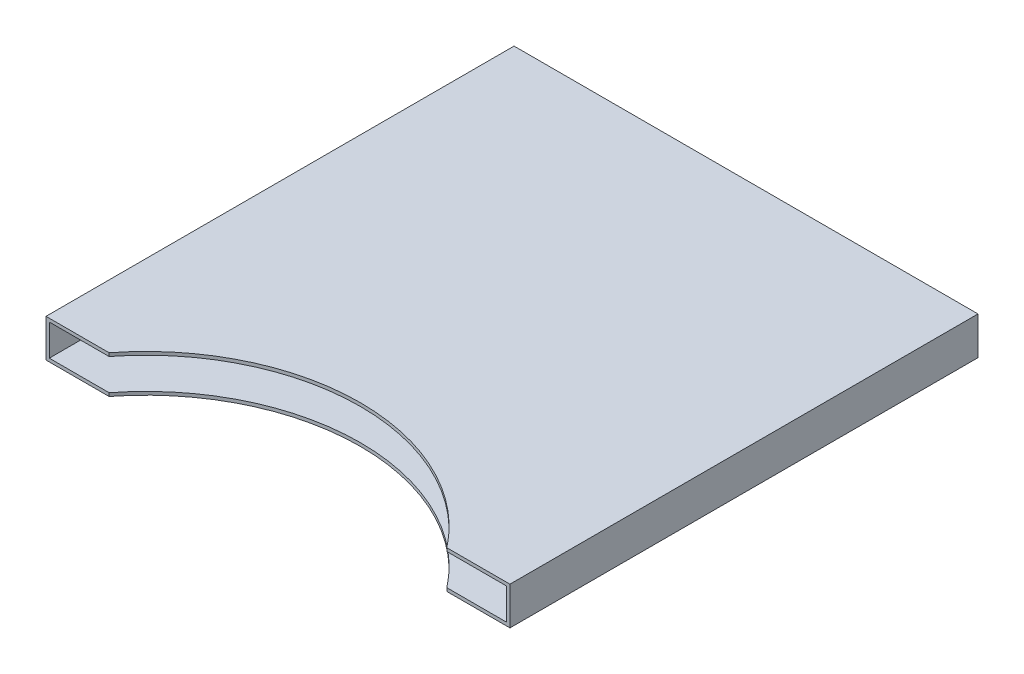
ISO-10303-21;
HEADER;
FILE_DESCRIPTION(('STEP AP214'),'2;1');
FILE_NAME('part.step','',(''),(''),'','','');
FILE_SCHEMA(('AUTOMOTIVE_DESIGN { 1 0 10303 214 1 1 1 1 }'));
ENDSEC;
DATA;
#1=APPLICATION_CONTEXT('core data for automotive mechanical design processes');
#2=APPLICATION_PROTOCOL_DEFINITION('international standard','automotive_design',2000,#1);
#3=PRODUCT_CONTEXT('',#1,'mechanical');
#4=PRODUCT('Part','Part','',(#3));
#5=PRODUCT_RELATED_PRODUCT_CATEGORY('part','',(#4));
#6=PRODUCT_DEFINITION_FORMATION('','',#4);
#7=PRODUCT_DEFINITION_CONTEXT('part definition',#1,'design');
#8=PRODUCT_DEFINITION('design','',#6,#7);
#9=PRODUCT_DEFINITION_SHAPE('','',#8);
#10=(LENGTH_UNIT() NAMED_UNIT(*) SI_UNIT(.MILLI.,.METRE.));
#11=(NAMED_UNIT(*) PLANE_ANGLE_UNIT() SI_UNIT($,.RADIAN.));
#12=(NAMED_UNIT(*) SI_UNIT($,.STERADIAN.) SOLID_ANGLE_UNIT());
#13=UNCERTAINTY_MEASURE_WITH_UNIT(LENGTH_MEASURE(1.E-05),#10,'distance_accuracy_value','');
#14=(GEOMETRIC_REPRESENTATION_CONTEXT(3) GLOBAL_UNCERTAINTY_ASSIGNED_CONTEXT((#13)) GLOBAL_UNIT_ASSIGNED_CONTEXT((#10,
#11,#12)) REPRESENTATION_CONTEXT('',''));
#15=CARTESIAN_POINT('',(0.,0.,0.));
#16=DIRECTION('',(0.,0.,1.));
#17=DIRECTION('',(1.,0.,0.));
#18=AXIS2_PLACEMENT_3D('',#15,#16,#17);
#19=CARTESIAN_POINT('',(0.,2.3,8.));
#20=DIRECTION('',(0.,1.,0.));
#21=DIRECTION('',(0.,0.,1.));
#22=AXIS2_PLACEMENT_3D('',#19,#20,#21);
#23=CYLINDRICAL_SURFACE('',#22,13.);
#24=CARTESIAN_POINT('',(0.,2.3,8.));
#25=DIRECTION('',(0.,1.,0.));
#26=DIRECTION('',(0.,0.,1.));
#27=AXIS2_PLACEMENT_3D('',#24,#25,#26);
#28=CIRCLE('',#27,13.);
#29=CARTESIAN_POINT('',(-10.2469507659597,2.3,0.));
#30=VERTEX_POINT('',#29);
#31=CARTESIAN_POINT('',(10.2469507659597,2.3,0.));
#32=VERTEX_POINT('',#31);
#33=EDGE_CURVE('E105',#30,#32,#28,.F.);
#34=ORIENTED_EDGE('',*,*,#33,.F.);
#35=DIRECTION('',(0.,1.,0.));
#36=VECTOR('',#35,1.);
#37=CARTESIAN_POINT('',(-10.2469507659598,2.3,1.96023752785379E-13));
#38=LINE('',#37,#36);
#39=CARTESIAN_POINT('',(-10.2469507659597,2.1,0.));
#40=VERTEX_POINT('',#39);
#41=EDGE_CURVE('E101',#40,#30,#38,.T.);
#42=ORIENTED_EDGE('',*,*,#41,.F.);
#43=CARTESIAN_POINT('',(0.,2.1,8.));
#44=DIRECTION('',(0.,1.,0.));
#45=DIRECTION('',(0.,0.,1.));
#46=AXIS2_PLACEMENT_3D('',#43,#44,#45);
#47=CIRCLE('',#46,13.);
#48=CARTESIAN_POINT('',(10.2469507659597,2.1,0.));
#49=VERTEX_POINT('',#48);
#50=EDGE_CURVE('E19',#40,#49,#47,.F.);
#51=ORIENTED_EDGE('',*,*,#50,.T.);
#52=DIRECTION('',(0.,1.,0.));
#53=VECTOR('',#52,1.);
#54=CARTESIAN_POINT('',(10.2469507659598,2.3,1.94289029309402E-13));
#55=LINE('',#54,#53);
#56=EDGE_CURVE('E108',#32,#49,#55,.F.);
#57=ORIENTED_EDGE('',*,*,#56,.F.);
#58=EDGE_LOOP('',(#34,#42,#51,#57));
#59=FACE_BOUND('',#58,.T.);
#60=ADVANCED_FACE('F16',(#59),#23,.F.);
#61=CARTESIAN_POINT('',(14.075,0.,-28.2));
#62=DIRECTION('',(0.,0.,-1.));
#63=DIRECTION('',(-1.,0.,0.));
#64=AXIS2_PLACEMENT_3D('',#61,#62,#63);
#65=PLANE('',#64);
#66=DIRECTION('',(1.,0.,0.));
#67=VECTOR('',#66,1.);
#68=CARTESIAN_POINT('',(0.,2.1,-28.2));
#69=LINE('',#68,#67);
#70=CARTESIAN_POINT('',(13.875,2.1,-28.2));
#71=VERTEX_POINT('',#70);
#72=CARTESIAN_POINT('',(-13.875,2.1,-28.2));
#73=VERTEX_POINT('',#72);
#74=EDGE_CURVE('E138',#71,#73,#69,.F.);
#75=ORIENTED_EDGE('',*,*,#74,.T.);
#76=DIRECTION('',(0.,1.,0.));
#77=VECTOR('',#76,1.);
#78=CARTESIAN_POINT('',(-13.875,0.,-28.2));
#79=LINE('',#78,#77);
#80=CARTESIAN_POINT('',(-13.875,0.2,-28.2));
#81=VERTEX_POINT('',#80);
#82=EDGE_CURVE('E119',#73,#81,#79,.F.);
#83=ORIENTED_EDGE('',*,*,#82,.T.);
#84=DIRECTION('',(1.,0.,0.));
#85=VECTOR('',#84,1.);
#86=CARTESIAN_POINT('',(0.,0.2,-28.2));
#87=LINE('',#86,#85);
#88=CARTESIAN_POINT('',(13.875,0.2,-28.2));
#89=VERTEX_POINT('',#88);
#90=EDGE_CURVE('E166',#89,#81,#87,.F.);
#91=ORIENTED_EDGE('',*,*,#90,.F.);
#92=DIRECTION('',(0.,1.,0.));
#93=VECTOR('',#92,1.);
#94=CARTESIAN_POINT('',(13.875,0.,-28.2));
#95=LINE('',#94,#93);
#96=EDGE_CURVE('E181',#89,#71,#95,.T.);
#97=ORIENTED_EDGE('',*,*,#96,.T.);
#98=EDGE_LOOP('',(#75,#83,#91,#97));
#99=FACE_BOUND('',#98,.T.);
#100=ADVANCED_FACE('F376',(#99),#65,.F.);
#101=CARTESIAN_POINT('',(13.875,0.,0.));
#102=DIRECTION('',(1.,0.,0.));
#103=DIRECTION('',(0.,0.,-1.));
#104=AXIS2_PLACEMENT_3D('',#101,#102,#103);
#105=PLANE('',#104);
#106=ORIENTED_EDGE('',*,*,#96,.F.);
#107=DIRECTION('',(0.,0.,1.));
#108=VECTOR('',#107,1.);
#109=CARTESIAN_POINT('',(13.875,0.2,0.));
#110=LINE('',#109,#108);
#111=CARTESIAN_POINT('',(13.875,0.2,0.));
#112=VERTEX_POINT('',#111);
#113=EDGE_CURVE('E163',#112,#89,#110,.F.);
#114=ORIENTED_EDGE('',*,*,#113,.F.);
#115=DIRECTION('',(0.,1.,0.));
#116=VECTOR('',#115,1.);
#117=CARTESIAN_POINT('',(13.875,0.,0.));
#118=LINE('',#117,#116);
#119=CARTESIAN_POINT('',(13.875,2.1,0.));
#120=VERTEX_POINT('',#119);
#121=EDGE_CURVE('E160',#120,#112,#118,.F.);
#122=ORIENTED_EDGE('',*,*,#121,.F.);
#123=DIRECTION('',(0.,0.,1.));
#124=VECTOR('',#123,1.);
#125=CARTESIAN_POINT('',(13.875,2.1,0.));
#126=LINE('',#125,#124);
#127=EDGE_CURVE('E118',#120,#71,#126,.F.);
#128=ORIENTED_EDGE('',*,*,#127,.T.);
#129=EDGE_LOOP('',(#106,#114,#122,#128));
#130=FACE_BOUND('',#129,.T.);
#131=ADVANCED_FACE('F367',(#130),#105,.F.);
#132=CARTESIAN_POINT('',(-13.875,0.,-28.4));
#133=DIRECTION('',(-1.,0.,0.));
#134=DIRECTION('',(0.,0.,1.));
#135=AXIS2_PLACEMENT_3D('',#132,#133,#134);
#136=PLANE('',#135);
#137=ORIENTED_EDGE('',*,*,#82,.F.);
#138=DIRECTION('',(0.,0.,1.));
#139=VECTOR('',#138,1.);
#140=CARTESIAN_POINT('',(-13.875,2.1,0.));
#141=LINE('',#140,#139);
#142=CARTESIAN_POINT('',(-13.875,2.1,0.));
#143=VERTEX_POINT('',#142);
#144=EDGE_CURVE('E136',#73,#143,#141,.T.);
#145=ORIENTED_EDGE('',*,*,#144,.T.);
#146=DIRECTION('',(0.,1.,0.));
#147=VECTOR('',#146,1.);
#148=CARTESIAN_POINT('',(-13.875,0.,0.));
#149=LINE('',#148,#147);
#150=CARTESIAN_POINT('',(-13.875,0.2,0.));
#151=VERTEX_POINT('',#150);
#152=EDGE_CURVE('E124',#151,#143,#149,.T.);
#153=ORIENTED_EDGE('',*,*,#152,.F.);
#154=DIRECTION('',(0.,0.,1.));
#155=VECTOR('',#154,1.);
#156=CARTESIAN_POINT('',(-13.875,0.2,0.));
#157=LINE('',#156,#155);
#158=EDGE_CURVE('E185',#81,#151,#157,.T.);
#159=ORIENTED_EDGE('',*,*,#158,.F.);
#160=EDGE_LOOP('',(#137,#145,#153,#159));
#161=FACE_BOUND('',#160,.T.);
#162=ADVANCED_FACE('F359',(#161),#136,.F.);
#163=CARTESIAN_POINT('',(0.,2.1,0.));
#164=DIRECTION('',(0.,1.,0.));
#165=DIRECTION('',(0.,0.,1.));
#166=AXIS2_PLACEMENT_3D('',#163,#164,#165);
#167=PLANE('',#166);
#168=ORIENTED_EDGE('',*,*,#74,.F.);
#169=ORIENTED_EDGE('',*,*,#127,.F.);
#170=DIRECTION('',(1.,0.,0.));
#171=VECTOR('',#170,1.);
#172=CARTESIAN_POINT('',(-14.075,2.1,0.));
#173=LINE('',#172,#171);
#174=EDGE_CURVE('E117',#49,#120,#173,.T.);
#175=ORIENTED_EDGE('',*,*,#174,.F.);
#176=ORIENTED_EDGE('',*,*,#50,.F.);
#177=DIRECTION('',(1.,0.,0.));
#178=VECTOR('',#177,1.);
#179=CARTESIAN_POINT('',(-14.075,2.1,0.));
#180=LINE('',#179,#178);
#181=EDGE_CURVE('E115',#143,#40,#180,.T.);
#182=ORIENTED_EDGE('',*,*,#181,.F.);
#183=ORIENTED_EDGE('',*,*,#144,.F.);
#184=EDGE_LOOP('',(#168,#169,#175,#176,#182,#183));
#185=FACE_BOUND('',#184,.T.);
#186=ADVANCED_FACE('F113',(#185),#167,.F.);
#187=CARTESIAN_POINT('',(0.,2.3,0.));
#188=DIRECTION('',(0.,1.,0.));
#189=DIRECTION('',(0.,0.,1.));
#190=AXIS2_PLACEMENT_3D('',#187,#188,#189);
#191=PLANE('',#190);
#192=DIRECTION('',(1.,0.,0.));
#193=VECTOR('',#192,1.);
#194=CARTESIAN_POINT('',(-14.075,2.3,0.));
#195=LINE('',#194,#193);
#196=CARTESIAN_POINT('',(-14.075,2.3,0.));
#197=VERTEX_POINT('',#196);
#198=EDGE_CURVE('E126',#30,#197,#195,.F.);
#199=ORIENTED_EDGE('',*,*,#198,.F.);
#200=ORIENTED_EDGE('',*,*,#33,.T.);
#201=DIRECTION('',(1.,0.,0.));
#202=VECTOR('',#201,1.);
#203=CARTESIAN_POINT('',(-14.075,2.3,0.));
#204=LINE('',#203,#202);
#205=CARTESIAN_POINT('',(14.075,2.3,0.));
#206=VERTEX_POINT('',#205);
#207=EDGE_CURVE('E152',#206,#32,#204,.F.);
#208=ORIENTED_EDGE('',*,*,#207,.F.);
#209=DIRECTION('',(0.,0.,-1.));
#210=VECTOR('',#209,1.);
#211=CARTESIAN_POINT('',(14.075,2.3,0.));
#212=LINE('',#211,#210);
#213=CARTESIAN_POINT('',(14.075,2.3,-28.4));
#214=VERTEX_POINT('',#213);
#215=EDGE_CURVE('E147',#214,#206,#212,.F.);
#216=ORIENTED_EDGE('',*,*,#215,.F.);
#217=DIRECTION('',(-1.,0.,0.));
#218=VECTOR('',#217,1.);
#219=CARTESIAN_POINT('',(14.075,2.3,-28.4));
#220=LINE('',#219,#218);
#221=CARTESIAN_POINT('',(-14.075,2.3,-28.4));
#222=VERTEX_POINT('',#221);
#223=EDGE_CURVE('E141',#222,#214,#220,.F.);
#224=ORIENTED_EDGE('',*,*,#223,.F.);
#225=DIRECTION('',(0.,0.,1.));
#226=VECTOR('',#225,1.);
#227=CARTESIAN_POINT('',(-14.075,2.3,-28.4));
#228=LINE('',#227,#226);
#229=EDGE_CURVE('E233',#197,#222,#228,.F.);
#230=ORIENTED_EDGE('',*,*,#229,.F.);
#231=EDGE_LOOP('',(#199,#200,#208,#216,#224,#230));
#232=FACE_BOUND('',#231,.T.);
#233=ADVANCED_FACE('F205',(#232),#191,.T.);
#234=CARTESIAN_POINT('',(0.,0.2,0.));
#235=DIRECTION('',(0.,1.,0.));
#236=DIRECTION('',(0.,0.,1.));
#237=AXIS2_PLACEMENT_3D('',#234,#235,#236);
#238=PLANE('',#237);
#239=ORIENTED_EDGE('',*,*,#158,.T.);
#240=DIRECTION('',(1.,0.,0.));
#241=VECTOR('',#240,1.);
#242=CARTESIAN_POINT('',(-14.075,0.2,0.));
#243=LINE('',#242,#241);
#244=CARTESIAN_POINT('',(-10.2469507659598,0.2,0.));
#245=VERTEX_POINT('',#244);
#246=EDGE_CURVE('E201',#245,#151,#243,.F.);
#247=ORIENTED_EDGE('',*,*,#246,.F.);
#248=CARTESIAN_POINT('',(0.,0.2,8.));
#249=DIRECTION('',(0.,1.,0.));
#250=DIRECTION('',(0.,0.,1.));
#251=AXIS2_PLACEMENT_3D('',#248,#249,#250);
#252=CIRCLE('',#251,13.);
#253=CARTESIAN_POINT('',(10.2469507659598,0.2,0.));
#254=VERTEX_POINT('',#253);
#255=EDGE_CURVE('E202',#245,#254,#252,.F.);
#256=ORIENTED_EDGE('',*,*,#255,.T.);
#257=DIRECTION('',(1.,0.,0.));
#258=VECTOR('',#257,1.);
#259=CARTESIAN_POINT('',(-14.075,0.2,0.));
#260=LINE('',#259,#258);
#261=EDGE_CURVE('E149',#112,#254,#260,.F.);
#262=ORIENTED_EDGE('',*,*,#261,.F.);
#263=ORIENTED_EDGE('',*,*,#113,.T.);
#264=ORIENTED_EDGE('',*,*,#90,.T.);
#265=EDGE_LOOP('',(#239,#247,#256,#262,#263,#264));
#266=FACE_BOUND('',#265,.T.);
#267=ADVANCED_FACE('F335',(#266),#238,.T.);
#268=CARTESIAN_POINT('',(0.,2.3,8.));
#269=DIRECTION('',(0.,1.,0.));
#270=DIRECTION('',(0.,0.,1.));
#271=AXIS2_PLACEMENT_3D('',#268,#269,#270);
#272=CYLINDRICAL_SURFACE('',#271,13.);
#273=CARTESIAN_POINT('',(0.,0.,8.));
#274=DIRECTION('',(0.,1.,0.));
#275=DIRECTION('',(0.,0.,1.));
#276=AXIS2_PLACEMENT_3D('',#273,#274,#275);
#277=CIRCLE('',#276,13.);
#278=CARTESIAN_POINT('',(-10.2469507659598,0.,0.));
#279=VERTEX_POINT('',#278);
#280=CARTESIAN_POINT('',(10.2469507659598,0.,0.));
#281=VERTEX_POINT('',#280);
#282=EDGE_CURVE('E197',#279,#281,#277,.F.);
#283=ORIENTED_EDGE('',*,*,#282,.T.);
#284=DIRECTION('',(0.,1.,0.));
#285=VECTOR('',#284,1.);
#286=CARTESIAN_POINT('',(10.24695076596,0.,0.));
#287=LINE('',#286,#285);
#288=EDGE_CURVE('E155',#254,#281,#287,.F.);
#289=ORIENTED_EDGE('',*,*,#288,.F.);
#290=ORIENTED_EDGE('',*,*,#255,.F.);
#291=DIRECTION('',(0.,1.,0.));
#292=VECTOR('',#291,1.);
#293=CARTESIAN_POINT('',(-10.24695076596,0.,0.));
#294=LINE('',#293,#292);
#295=EDGE_CURVE('E225',#279,#245,#294,.T.);
#296=ORIENTED_EDGE('',*,*,#295,.F.);
#297=EDGE_LOOP('',(#283,#289,#290,#296));
#298=FACE_BOUND('',#297,.T.);
#299=ADVANCED_FACE('F281',(#298),#272,.F.);
#300=CARTESIAN_POINT('',(-14.075,0.,0.));
#301=DIRECTION('',(0.,0.,1.));
#302=DIRECTION('',(1.,0.,0.));
#303=AXIS2_PLACEMENT_3D('',#300,#301,#302);
#304=PLANE('',#303);
#305=ORIENTED_EDGE('',*,*,#121,.T.);
#306=ORIENTED_EDGE('',*,*,#261,.T.);
#307=ORIENTED_EDGE('',*,*,#288,.T.);
#308=DIRECTION('',(1.,0.,0.));
#309=VECTOR('',#308,1.);
#310=CARTESIAN_POINT('',(0.,0.,0.));
#311=LINE('',#310,#309);
#312=CARTESIAN_POINT('',(14.075,0.,0.));
#313=VERTEX_POINT('',#312);
#314=EDGE_CURVE('E200',#281,#313,#311,.T.);
#315=ORIENTED_EDGE('',*,*,#314,.T.);
#316=DIRECTION('',(0.,1.,0.));
#317=VECTOR('',#316,1.);
#318=CARTESIAN_POINT('',(14.075,0.,0.));
#319=LINE('',#318,#317);
#320=EDGE_CURVE('E144',#206,#313,#319,.F.);
#321=ORIENTED_EDGE('',*,*,#320,.F.);
#322=ORIENTED_EDGE('',*,*,#207,.T.);
#323=ORIENTED_EDGE('',*,*,#56,.T.);
#324=ORIENTED_EDGE('',*,*,#174,.T.);
#325=EDGE_LOOP('',(#305,#306,#307,#315,#321,#322,#323,#324));
#326=FACE_BOUND('',#325,.T.);
#327=ADVANCED_FACE('F210',(#326),#304,.T.);
#328=CARTESIAN_POINT('',(14.075,0.,0.));
#329=DIRECTION('',(1.,0.,0.));
#330=DIRECTION('',(0.,0.,-1.));
#331=AXIS2_PLACEMENT_3D('',#328,#329,#330);
#332=PLANE('',#331);
#333=ORIENTED_EDGE('',*,*,#320,.T.);
#334=DIRECTION('',(0.,0.,1.));
#335=VECTOR('',#334,1.);
#336=CARTESIAN_POINT('',(14.075,0.,0.));
#337=LINE('',#336,#335);
#338=CARTESIAN_POINT('',(14.075,0.,-28.4));
#339=VERTEX_POINT('',#338);
#340=EDGE_CURVE('E249',#313,#339,#337,.F.);
#341=ORIENTED_EDGE('',*,*,#340,.T.);
#342=DIRECTION('',(0.,1.,0.));
#343=VECTOR('',#342,1.);
#344=CARTESIAN_POINT('',(14.075,0.,-28.4));
#345=LINE('',#344,#343);
#346=EDGE_CURVE('E143',#214,#339,#345,.F.);
#347=ORIENTED_EDGE('',*,*,#346,.F.);
#348=ORIENTED_EDGE('',*,*,#215,.T.);
#349=EDGE_LOOP('',(#333,#341,#347,#348));
#350=FACE_BOUND('',#349,.T.);
#351=ADVANCED_FACE('F272',(#350),#332,.T.);
#352=CARTESIAN_POINT('',(14.075,0.,-28.4));
#353=DIRECTION('',(0.,0.,-1.));
#354=DIRECTION('',(-1.,0.,0.));
#355=AXIS2_PLACEMENT_3D('',#352,#353,#354);
#356=PLANE('',#355);
#357=ORIENTED_EDGE('',*,*,#346,.T.);
#358=DIRECTION('',(1.,0.,0.));
#359=VECTOR('',#358,1.);
#360=CARTESIAN_POINT('',(0.,0.,-28.4));
#361=LINE('',#360,#359);
#362=CARTESIAN_POINT('',(-14.075,0.,-28.4));
#363=VERTEX_POINT('',#362);
#364=EDGE_CURVE('E250',#339,#363,#361,.F.);
#365=ORIENTED_EDGE('',*,*,#364,.T.);
#366=DIRECTION('',(0.,1.,0.));
#367=VECTOR('',#366,1.);
#368=CARTESIAN_POINT('',(-14.075,0.,-28.4));
#369=LINE('',#368,#367);
#370=EDGE_CURVE('E129',#222,#363,#369,.F.);
#371=ORIENTED_EDGE('',*,*,#370,.F.);
#372=ORIENTED_EDGE('',*,*,#223,.T.);
#373=EDGE_LOOP('',(#357,#365,#371,#372));
#374=FACE_BOUND('',#373,.T.);
#375=ADVANCED_FACE('F271',(#374),#356,.T.);
#376=CARTESIAN_POINT('',(-14.075,0.,-28.4));
#377=DIRECTION('',(-1.,0.,0.));
#378=DIRECTION('',(0.,0.,1.));
#379=AXIS2_PLACEMENT_3D('',#376,#377,#378);
#380=PLANE('',#379);
#381=ORIENTED_EDGE('',*,*,#370,.T.);
#382=DIRECTION('',(0.,0.,1.));
#383=VECTOR('',#382,1.);
#384=CARTESIAN_POINT('',(-14.075,0.,0.));
#385=LINE('',#384,#383);
#386=CARTESIAN_POINT('',(-14.075,0.,0.));
#387=VERTEX_POINT('',#386);
#388=EDGE_CURVE('E25',#363,#387,#385,.T.);
#389=ORIENTED_EDGE('',*,*,#388,.T.);
#390=DIRECTION('',(0.,1.,0.));
#391=VECTOR('',#390,1.);
#392=CARTESIAN_POINT('',(-14.075,0.,0.));
#393=LINE('',#392,#391);
#394=EDGE_CURVE('E33',#197,#387,#393,.F.);
#395=ORIENTED_EDGE('',*,*,#394,.F.);
#396=ORIENTED_EDGE('',*,*,#229,.T.);
#397=EDGE_LOOP('',(#381,#389,#395,#396));
#398=FACE_BOUND('',#397,.T.);
#399=ADVANCED_FACE('F267',(#398),#380,.T.);
#400=CARTESIAN_POINT('',(-14.075,0.,0.));
#401=DIRECTION('',(0.,0.,1.));
#402=DIRECTION('',(1.,0.,0.));
#403=AXIS2_PLACEMENT_3D('',#400,#401,#402);
#404=PLANE('',#403);
#405=ORIENTED_EDGE('',*,*,#295,.T.);
#406=ORIENTED_EDGE('',*,*,#246,.T.);
#407=ORIENTED_EDGE('',*,*,#152,.T.);
#408=ORIENTED_EDGE('',*,*,#181,.T.);
#409=ORIENTED_EDGE('',*,*,#41,.T.);
#410=ORIENTED_EDGE('',*,*,#198,.T.);
#411=ORIENTED_EDGE('',*,*,#394,.T.);
#412=DIRECTION('',(1.,0.,0.));
#413=VECTOR('',#412,1.);
#414=CARTESIAN_POINT('',(0.,0.,0.));
#415=LINE('',#414,#413);
#416=EDGE_CURVE('E11',#387,#279,#415,.T.);
#417=ORIENTED_EDGE('',*,*,#416,.T.);
#418=EDGE_LOOP('',(#405,#406,#407,#408,#409,#410,#411,#417));
#419=FACE_BOUND('',#418,.T.);
#420=ADVANCED_FACE('F121',(#419),#404,.T.);
#421=CARTESIAN_POINT('',(0.,0.,0.));
#422=DIRECTION('',(0.,1.,0.));
#423=DIRECTION('',(0.,0.,1.));
#424=AXIS2_PLACEMENT_3D('',#421,#422,#423);
#425=PLANE('',#424);
#426=ORIENTED_EDGE('',*,*,#388,.F.);
#427=ORIENTED_EDGE('',*,*,#364,.F.);
#428=ORIENTED_EDGE('',*,*,#340,.F.);
#429=ORIENTED_EDGE('',*,*,#314,.F.);
#430=ORIENTED_EDGE('',*,*,#282,.F.);
#431=ORIENTED_EDGE('',*,*,#416,.F.);
#432=EDGE_LOOP('',(#426,#427,#428,#429,#430,#431));
#433=FACE_BOUND('',#432,.T.);
#434=ADVANCED_FACE('F270',(#433),#425,.F.);
#435=CLOSED_SHELL('',(#60,#100,#131,#162,#186,#233,#267,#299,#327,#351,#375,#399,#420,#434));
#436=MANIFOLD_SOLID_BREP('B1',#435);
#437=ADVANCED_BREP_SHAPE_REPRESENTATION('',(#18,#436),#14);
#438=SHAPE_DEFINITION_REPRESENTATION(#9,#437);
ENDSEC;
END-ISO-10303-21;
